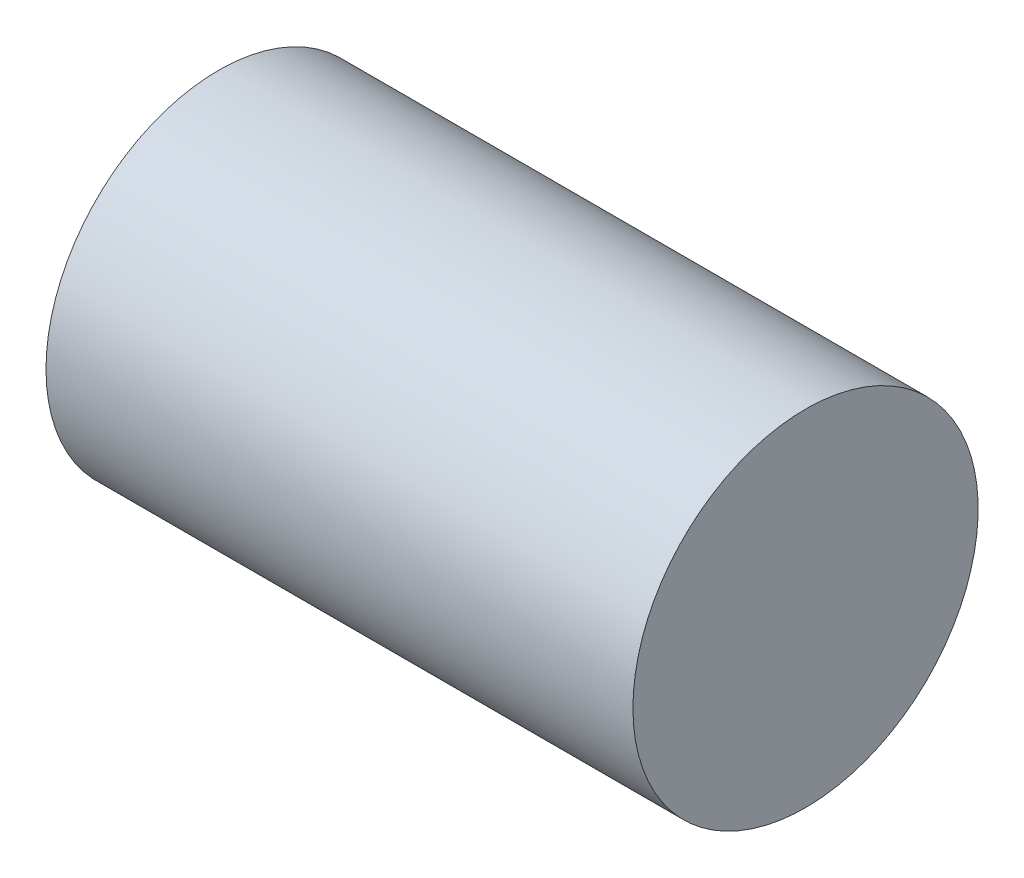
ISO-10303-21;
HEADER;
FILE_DESCRIPTION(('STEP AP214'),'2;1');
FILE_NAME('part.step','',(''),(''),'','','');
FILE_SCHEMA(('AUTOMOTIVE_DESIGN { 1 0 10303 214 1 1 1 1 }'));
ENDSEC;
DATA;
#1=APPLICATION_CONTEXT('core data for automotive mechanical design processes');
#2=APPLICATION_PROTOCOL_DEFINITION('international standard','automotive_design',2000,#1);
#3=PRODUCT_CONTEXT('',#1,'mechanical');
#4=PRODUCT('Part','Part','',(#3));
#5=PRODUCT_RELATED_PRODUCT_CATEGORY('part','',(#4));
#6=PRODUCT_DEFINITION_FORMATION('','',#4);
#7=PRODUCT_DEFINITION_CONTEXT('part definition',#1,'design');
#8=PRODUCT_DEFINITION('design','',#6,#7);
#9=PRODUCT_DEFINITION_SHAPE('','',#8);
#10=(LENGTH_UNIT() NAMED_UNIT(*) SI_UNIT(.MILLI.,.METRE.));
#11=(NAMED_UNIT(*) PLANE_ANGLE_UNIT() SI_UNIT($,.RADIAN.));
#12=(NAMED_UNIT(*) SI_UNIT($,.STERADIAN.) SOLID_ANGLE_UNIT());
#13=UNCERTAINTY_MEASURE_WITH_UNIT(LENGTH_MEASURE(1.E-05),#10,'distance_accuracy_value','');
#14=(GEOMETRIC_REPRESENTATION_CONTEXT(3) GLOBAL_UNCERTAINTY_ASSIGNED_CONTEXT((#13)) GLOBAL_UNIT_ASSIGNED_CONTEXT((#10,
#11,#12)) REPRESENTATION_CONTEXT('',''));
#15=CARTESIAN_POINT('',(0.,0.,0.));
#16=DIRECTION('',(0.,0.,1.));
#17=DIRECTION('',(1.,0.,0.));
#18=AXIS2_PLACEMENT_3D('',#15,#16,#17);
#19=CARTESIAN_POINT('',(-9.15590551181102,1.2,0.));
#20=DIRECTION('',(1.,0.,0.));
#21=DIRECTION('',(0.,0.,-1.));
#22=AXIS2_PLACEMENT_3D('',#19,#20,#21);
#23=PLANE('',#22);
#24=CARTESIAN_POINT('',(-9.15590551181102,0.,0.));
#25=DIRECTION('',(-1.,0.,0.));
#26=DIRECTION('',(0.,0.,1.));
#27=AXIS2_PLACEMENT_3D('',#24,#25,#26);
#28=CIRCLE('',#27,1.2);
#29=CARTESIAN_POINT('',(-9.15590551181102,0.,1.2));
#30=VERTEX_POINT('',#29);
#31=EDGE_CURVE('E45',#30,#30,#28,.T.);
#32=ORIENTED_EDGE('',*,*,#31,.T.);
#33=EDGE_LOOP('',(#32));
#34=FACE_BOUND('',#33,.T.);
#35=ADVANCED_FACE('F39',(#34),#23,.F.);
#36=CARTESIAN_POINT('',(-5.07590551181102,0.,0.));
#37=DIRECTION('',(-1.,0.,0.));
#38=DIRECTION('',(0.,0.,1.));
#39=AXIS2_PLACEMENT_3D('',#36,#37,#38);
#40=PLANE('',#39);
#41=CARTESIAN_POINT('',(-5.07590551181102,0.,0.));
#42=DIRECTION('',(-1.,0.,0.));
#43=DIRECTION('',(0.,0.,1.));
#44=AXIS2_PLACEMENT_3D('',#41,#42,#43);
#45=CIRCLE('',#44,1.2);
#46=CARTESIAN_POINT('',(-5.07590551181102,0.,1.2));
#47=VERTEX_POINT('',#46);
#48=EDGE_CURVE('E10',#47,#47,#45,.T.);
#49=ORIENTED_EDGE('',*,*,#48,.F.);
#50=EDGE_LOOP('',(#49));
#51=FACE_BOUND('',#50,.T.);
#52=ADVANCED_FACE('F54',(#51),#40,.F.);
#53=CARTESIAN_POINT('',(-9.15590551181102,0.,0.));
#54=DIRECTION('',(-1.,0.,0.));
#55=DIRECTION('',(0.,0.,1.));
#56=AXIS2_PLACEMENT_3D('',#53,#54,#55);
#57=CYLINDRICAL_SURFACE('',#56,1.2);
#58=ORIENTED_EDGE('',*,*,#31,.F.);
#59=EDGE_LOOP('',(#58));
#60=FACE_BOUND('',#59,.T.);
#61=ORIENTED_EDGE('',*,*,#48,.T.);
#62=EDGE_LOOP('',(#61));
#63=FACE_BOUND('',#62,.T.);
#64=ADVANCED_FACE('F52',(#60,#63),#57,.T.);
#65=CLOSED_SHELL('',(#35,#52,#64));
#66=MANIFOLD_SOLID_BREP('B2',#65);
#67=ADVANCED_BREP_SHAPE_REPRESENTATION('',(#18,#66),#14);
#68=SHAPE_DEFINITION_REPRESENTATION(#9,#67);
ENDSEC;
END-ISO-10303-21;
